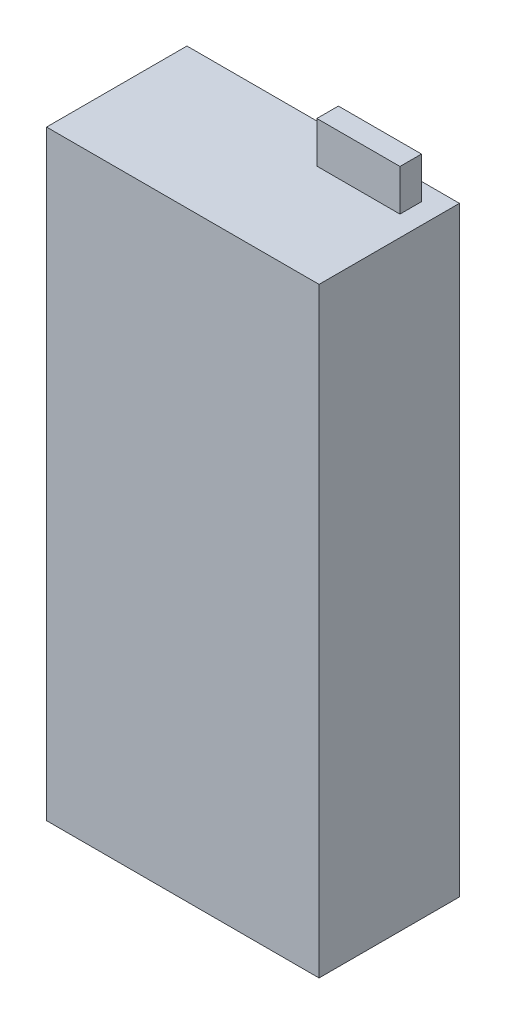
ISO-10303-21;
HEADER;
FILE_DESCRIPTION(('STEP AP214'),'2;1');
FILE_NAME('part.step','',(''),(''),'','','');
FILE_SCHEMA(('AUTOMOTIVE_DESIGN { 1 0 10303 214 1 1 1 1 }'));
ENDSEC;
DATA;
#1=APPLICATION_CONTEXT('core data for automotive mechanical design processes');
#2=APPLICATION_PROTOCOL_DEFINITION('international standard','automotive_design',2000,#1);
#3=PRODUCT_CONTEXT('',#1,'mechanical');
#4=PRODUCT('Part','Part','',(#3));
#5=PRODUCT_RELATED_PRODUCT_CATEGORY('part','',(#4));
#6=PRODUCT_DEFINITION_FORMATION('','',#4);
#7=PRODUCT_DEFINITION_CONTEXT('part definition',#1,'design');
#8=PRODUCT_DEFINITION('design','',#6,#7);
#9=PRODUCT_DEFINITION_SHAPE('','',#8);
#10=(LENGTH_UNIT() NAMED_UNIT(*) SI_UNIT(.MILLI.,.METRE.));
#11=(NAMED_UNIT(*) PLANE_ANGLE_UNIT() SI_UNIT($,.RADIAN.));
#12=(NAMED_UNIT(*) SI_UNIT($,.STERADIAN.) SOLID_ANGLE_UNIT());
#13=UNCERTAINTY_MEASURE_WITH_UNIT(LENGTH_MEASURE(1.E-05),#10,'distance_accuracy_value','');
#14=(GEOMETRIC_REPRESENTATION_CONTEXT(3) GLOBAL_UNCERTAINTY_ASSIGNED_CONTEXT((#13)) GLOBAL_UNIT_ASSIGNED_CONTEXT((#10,
#11,#12)) REPRESENTATION_CONTEXT('',''));
#15=CARTESIAN_POINT('',(0.,0.,0.));
#16=DIRECTION('',(0.,0.,1.));
#17=DIRECTION('',(1.,0.,0.));
#18=AXIS2_PLACEMENT_3D('',#15,#16,#17);
#19=CARTESIAN_POINT('',(-193.074626865671,287.149253731343,68.));
#20=DIRECTION('',(0.,-1.,0.));
#21=DIRECTION('',(0.,0.,-1.));
#22=AXIS2_PLACEMENT_3D('',#19,#20,#21);
#23=PLANE('',#22);
#24=DIRECTION('',(-1.,0.,0.));
#25=VECTOR('',#24,1.);
#26=CARTESIAN_POINT('',(-193.074626865671,287.149253731343,0.));
#27=LINE('',#26,#25);
#28=CARTESIAN_POINT('',(-61.0746268656714,287.149253731343,0.));
#29=VERTEX_POINT('',#28);
#30=CARTESIAN_POINT('',(-193.074626865671,287.149253731343,0.));
#31=VERTEX_POINT('',#30);
#32=EDGE_CURVE('E260',#29,#31,#27,.T.);
#33=ORIENTED_EDGE('',*,*,#32,.T.);
#34=DIRECTION('',(0.,0.,-1.));
#35=VECTOR('',#34,1.);
#36=CARTESIAN_POINT('',(-193.074626865671,287.149253731343,68.));
#37=LINE('',#36,#35);
#38=CARTESIAN_POINT('',(-193.074626865671,287.149253731343,68.));
#39=VERTEX_POINT('',#38);
#40=EDGE_CURVE('E270',#39,#31,#37,.T.);
#41=ORIENTED_EDGE('',*,*,#40,.F.);
#42=DIRECTION('',(-1.,0.,0.));
#43=VECTOR('',#42,1.);
#44=CARTESIAN_POINT('',(-193.074626865671,287.149253731343,68.));
#45=LINE('',#44,#43);
#46=CARTESIAN_POINT('',(-61.0746268656714,287.149253731343,68.));
#47=VERTEX_POINT('',#46);
#48=EDGE_CURVE('E250',#47,#39,#45,.T.);
#49=ORIENTED_EDGE('',*,*,#48,.F.);
#50=DIRECTION('',(0.,0.,-1.));
#51=VECTOR('',#50,1.);
#52=CARTESIAN_POINT('',(-61.0746268656714,287.149253731343,68.));
#53=LINE('',#52,#51);
#54=EDGE_CURVE('E55',#47,#29,#53,.T.);
#55=ORIENTED_EDGE('',*,*,#54,.T.);
#56=EDGE_LOOP('',(#33,#41,#49,#55));
#57=FACE_BOUND('',#56,.T.);
#58=DIRECTION('',(0.,0.,-1.));
#59=VECTOR('',#58,1.);
#60=CARTESIAN_POINT('',(-70.9483850455754,287.149253731343,18.9315760103987));
#61=LINE('',#60,#59);
#62=CARTESIAN_POINT('',(-70.9483850455754,287.149253731343,18.9315760103987));
#63=VERTEX_POINT('',#62);
#64=CARTESIAN_POINT('',(-70.9483850455754,287.149253731343,8.50918604596274));
#65=VERTEX_POINT('',#64);
#66=EDGE_CURVE('E156',#63,#65,#61,.T.);
#67=ORIENTED_EDGE('',*,*,#66,.F.);
#68=DIRECTION('',(1.,0.,0.));
#69=VECTOR('',#68,1.);
#70=CARTESIAN_POINT('',(-70.9483850455754,287.149253731343,18.9315760103987));
#71=LINE('',#70,#69);
#72=CARTESIAN_POINT('',(-111.202194247014,287.149253731343,18.9315760103987));
#73=VERTEX_POINT('',#72);
#74=EDGE_CURVE('E153',#73,#63,#71,.T.);
#75=ORIENTED_EDGE('',*,*,#74,.F.);
#76=DIRECTION('',(0.,0.,1.));
#77=VECTOR('',#76,1.);
#78=CARTESIAN_POINT('',(-111.202194247014,287.149253731343,18.9315760103987));
#79=LINE('',#78,#77);
#80=CARTESIAN_POINT('',(-111.202194247014,287.149253731343,8.50918604596274));
#81=VERTEX_POINT('',#80);
#82=EDGE_CURVE('E67',#81,#73,#79,.T.);
#83=ORIENTED_EDGE('',*,*,#82,.F.);
#84=DIRECTION('',(-1.,0.,0.));
#85=VECTOR('',#84,1.);
#86=CARTESIAN_POINT('',(-70.9483850455754,287.149253731343,8.50918604596274));
#87=LINE('',#86,#85);
#88=EDGE_CURVE('E62',#65,#81,#87,.T.);
#89=ORIENTED_EDGE('',*,*,#88,.F.);
#90=EDGE_LOOP('',(#67,#75,#83,#89));
#91=FACE_BOUND('',#90,.T.);
#92=ADVANCED_FACE('F47',(#57,#91),#23,.F.);
#93=CARTESIAN_POINT('',(-193.074626865671,-3.85074626865733,68.));
#94=DIRECTION('',(0.,1.,0.));
#95=DIRECTION('',(0.,0.,1.));
#96=AXIS2_PLACEMENT_3D('',#93,#94,#95);
#97=PLANE('',#96);
#98=CARTESIAN_POINT('',(-94.2518577073983,-3.85074626865733,37.5871900616787));
#99=DIRECTION('',(0.,1.,0.));
#100=DIRECTION('',(0.,0.,1.));
#101=AXIS2_PLACEMENT_3D('',#98,#99,#100);
#102=CIRCLE('',#101,24.1206050750484);
#103=CARTESIAN_POINT('',(-94.2518577073983,-3.85074626865733,61.707795136727));
#104=VERTEX_POINT('',#103);
#105=EDGE_CURVE('E13',#104,#104,#102,.F.);
#106=ORIENTED_EDGE('',*,*,#105,.F.);
#107=EDGE_LOOP('',(#106));
#108=FACE_BOUND('',#107,.T.);
#109=DIRECTION('',(1.,0.,0.));
#110=VECTOR('',#109,1.);
#111=CARTESIAN_POINT('',(-193.074626865671,-3.85074626865733,0.));
#112=LINE('',#111,#110);
#113=CARTESIAN_POINT('',(-193.074626865671,-3.85074626865733,0.));
#114=VERTEX_POINT('',#113);
#115=CARTESIAN_POINT('',(-61.0746268656714,-3.85074626865733,0.));
#116=VERTEX_POINT('',#115);
#117=EDGE_CURVE('E251',#114,#116,#112,.T.);
#118=ORIENTED_EDGE('',*,*,#117,.T.);
#119=DIRECTION('',(0.,0.,-1.));
#120=VECTOR('',#119,1.);
#121=CARTESIAN_POINT('',(-61.0746268656714,-3.85074626865733,68.));
#122=LINE('',#121,#120);
#123=CARTESIAN_POINT('',(-61.0746268656714,-3.85074626865733,68.));
#124=VERTEX_POINT('',#123);
#125=EDGE_CURVE('E257',#124,#116,#122,.T.);
#126=ORIENTED_EDGE('',*,*,#125,.F.);
#127=DIRECTION('',(1.,0.,0.));
#128=VECTOR('',#127,1.);
#129=CARTESIAN_POINT('',(-193.074626865671,-3.85074626865733,68.));
#130=LINE('',#129,#128);
#131=CARTESIAN_POINT('',(-193.074626865671,-3.85074626865733,68.));
#132=VERTEX_POINT('',#131);
#133=EDGE_CURVE('E255',#132,#124,#130,.T.);
#134=ORIENTED_EDGE('',*,*,#133,.F.);
#135=DIRECTION('',(0.,0.,-1.));
#136=VECTOR('',#135,1.);
#137=CARTESIAN_POINT('',(-193.074626865671,-3.85074626865733,68.));
#138=LINE('',#137,#136);
#139=EDGE_CURVE('E267',#132,#114,#138,.T.);
#140=ORIENTED_EDGE('',*,*,#139,.T.);
#141=EDGE_LOOP('',(#118,#126,#134,#140));
#142=FACE_BOUND('',#141,.T.);
#143=DIRECTION('',(0.,0.,-1.));
#144=VECTOR('',#143,1.);
#145=CARTESIAN_POINT('',(-178.598349927007,-3.85074626865733,24.2213644367162));
#146=LINE('',#145,#144);
#147=CARTESIAN_POINT('',(-178.598349927007,-3.85074626865733,24.2213644367162));
#148=VERTEX_POINT('',#147);
#149=CARTESIAN_POINT('',(-178.598349927007,-3.85074626865733,14.0191888236423));
#150=VERTEX_POINT('',#149);
#151=EDGE_CURVE('E160',#148,#150,#146,.T.);
#152=ORIENTED_EDGE('',*,*,#151,.F.);
#153=DIRECTION('',(-1.,0.,0.));
#154=VECTOR('',#153,1.);
#155=CARTESIAN_POINT('',(-178.598349927007,-3.85074626865733,24.2213644367162));
#156=LINE('',#155,#154);
#157=CARTESIAN_POINT('',(-125.545069393354,-3.85074626865733,24.2213644367162));
#158=VERTEX_POINT('',#157);
#159=EDGE_CURVE('E170',#158,#148,#156,.T.);
#160=ORIENTED_EDGE('',*,*,#159,.F.);
#161=DIRECTION('',(0.,0.,1.));
#162=VECTOR('',#161,1.);
#163=CARTESIAN_POINT('',(-125.545069393354,-3.85074626865733,24.2213644367162));
#164=LINE('',#163,#162);
#165=CARTESIAN_POINT('',(-125.545069393354,-3.85074626865733,14.0191888236423));
#166=VERTEX_POINT('',#165);
#167=EDGE_CURVE('E182',#166,#158,#164,.T.);
#168=ORIENTED_EDGE('',*,*,#167,.F.);
#169=DIRECTION('',(1.,0.,0.));
#170=VECTOR('',#169,1.);
#171=CARTESIAN_POINT('',(-178.598349927007,-3.85074626865733,14.0191888236423));
#172=LINE('',#171,#170);
#173=EDGE_CURVE('E179',#150,#166,#172,.T.);
#174=ORIENTED_EDGE('',*,*,#173,.F.);
#175=EDGE_LOOP('',(#152,#160,#168,#174));
#176=FACE_BOUND('',#175,.T.);
#177=ADVANCED_FACE('F290',(#108,#142,#176),#97,.F.);
#178=CARTESIAN_POINT('',(-61.0746268656714,287.149253731343,68.));
#179=DIRECTION('',(-1.,0.,0.));
#180=DIRECTION('',(0.,-1.,0.));
#181=AXIS2_PLACEMENT_3D('',#178,#179,#180);
#182=PLANE('',#181);
#183=DIRECTION('',(0.,1.,0.));
#184=VECTOR('',#183,1.);
#185=CARTESIAN_POINT('',(-61.0746268656714,287.149253731343,0.));
#186=LINE('',#185,#184);
#187=EDGE_CURVE('E244',#116,#29,#186,.T.);
#188=ORIENTED_EDGE('',*,*,#187,.T.);
#189=ORIENTED_EDGE('',*,*,#54,.F.);
#190=DIRECTION('',(0.,1.,0.));
#191=VECTOR('',#190,1.);
#192=CARTESIAN_POINT('',(-61.0746268656714,287.149253731343,68.));
#193=LINE('',#192,#191);
#194=EDGE_CURVE('E247',#124,#47,#193,.T.);
#195=ORIENTED_EDGE('',*,*,#194,.F.);
#196=ORIENTED_EDGE('',*,*,#125,.T.);
#197=EDGE_LOOP('',(#188,#189,#195,#196));
#198=FACE_BOUND('',#197,.T.);
#199=ADVANCED_FACE('F49',(#198),#182,.F.);
#200=CARTESIAN_POINT('',(-193.074626865671,287.149253731343,68.));
#201=DIRECTION('',(1.,0.,0.));
#202=DIRECTION('',(0.,1.,0.));
#203=AXIS2_PLACEMENT_3D('',#200,#201,#202);
#204=PLANE('',#203);
#205=CARTESIAN_POINT('',(-193.074626865671,23.1492537313427,55.5));
#206=DIRECTION('',(-1.,0.,0.));
#207=DIRECTION('',(0.,-1.,0.));
#208=AXIS2_PLACEMENT_3D('',#205,#206,#207);
#209=CIRCLE('',#208,2.);
#210=CARTESIAN_POINT('',(-193.074626865671,21.1492537313427,55.5));
#211=VERTEX_POINT('',#210);
#212=EDGE_CURVE('E221',#211,#211,#209,.T.);
#213=ORIENTED_EDGE('',*,*,#212,.F.);
#214=EDGE_LOOP('',(#213));
#215=FACE_BOUND('',#214,.T.);
#216=CARTESIAN_POINT('',(-193.074626865671,33.1492537313427,55.5));
#217=DIRECTION('',(-1.,0.,0.));
#218=DIRECTION('',(0.,-1.,0.));
#219=AXIS2_PLACEMENT_3D('',#216,#217,#218);
#220=CIRCLE('',#219,2.);
#221=CARTESIAN_POINT('',(-193.074626865671,31.1492537313427,55.5));
#222=VERTEX_POINT('',#221);
#223=EDGE_CURVE('E227',#222,#222,#220,.T.);
#224=ORIENTED_EDGE('',*,*,#223,.F.);
#225=EDGE_LOOP('',(#224));
#226=FACE_BOUND('',#225,.T.);
#227=CARTESIAN_POINT('',(-193.074626865671,33.1492537313427,17.5));
#228=DIRECTION('',(-1.,0.,0.));
#229=DIRECTION('',(0.,-1.,0.));
#230=AXIS2_PLACEMENT_3D('',#227,#228,#229);
#231=CIRCLE('',#230,2.);
#232=CARTESIAN_POINT('',(-193.074626865671,31.1492537313427,17.5));
#233=VERTEX_POINT('',#232);
#234=EDGE_CURVE('E233',#233,#233,#231,.T.);
#235=ORIENTED_EDGE('',*,*,#234,.F.);
#236=EDGE_LOOP('',(#235));
#237=FACE_BOUND('',#236,.T.);
#238=CARTESIAN_POINT('',(-193.074626865671,269.449253731343,17.5));
#239=DIRECTION('',(-1.,0.,0.));
#240=DIRECTION('',(0.,1.,0.));
#241=AXIS2_PLACEMENT_3D('',#238,#239,#240);
#242=CIRCLE('',#241,2.00000000000001);
#243=CARTESIAN_POINT('',(-193.074626865671,271.449253731343,17.5));
#244=VERTEX_POINT('',#243);
#245=EDGE_CURVE('E202',#244,#244,#242,.T.);
#246=ORIENTED_EDGE('',*,*,#245,.F.);
#247=EDGE_LOOP('',(#246));
#248=FACE_BOUND('',#247,.T.);
#249=CARTESIAN_POINT('',(-193.074626865671,259.449253731343,17.5));
#250=DIRECTION('',(-1.,0.,0.));
#251=DIRECTION('',(0.,1.,0.));
#252=AXIS2_PLACEMENT_3D('',#249,#250,#251);
#253=CIRCLE('',#252,2.);
#254=CARTESIAN_POINT('',(-193.074626865671,261.449253731343,17.5));
#255=VERTEX_POINT('',#254);
#256=EDGE_CURVE('E203',#255,#255,#253,.T.);
#257=ORIENTED_EDGE('',*,*,#256,.F.);
#258=EDGE_LOOP('',(#257));
#259=FACE_BOUND('',#258,.T.);
#260=CARTESIAN_POINT('',(-193.074626865671,259.449253731343,55.5));
#261=DIRECTION('',(-1.,0.,0.));
#262=DIRECTION('',(0.,1.,0.));
#263=AXIS2_PLACEMENT_3D('',#260,#261,#262);
#264=CIRCLE('',#263,2.);
#265=CARTESIAN_POINT('',(-193.074626865671,261.449253731343,55.5));
#266=VERTEX_POINT('',#265);
#267=EDGE_CURVE('E209',#266,#266,#264,.T.);
#268=ORIENTED_EDGE('',*,*,#267,.F.);
#269=EDGE_LOOP('',(#268));
#270=FACE_BOUND('',#269,.T.);
#271=CARTESIAN_POINT('',(-193.074626865671,269.449253731343,55.5));
#272=DIRECTION('',(-1.,0.,0.));
#273=DIRECTION('',(0.,1.,0.));
#274=AXIS2_PLACEMENT_3D('',#271,#272,#273);
#275=CIRCLE('',#274,2.);
#276=CARTESIAN_POINT('',(-193.074626865671,271.449253731343,55.5));
#277=VERTEX_POINT('',#276);
#278=EDGE_CURVE('E198',#277,#277,#275,.T.);
#279=ORIENTED_EDGE('',*,*,#278,.F.);
#280=EDGE_LOOP('',(#279));
#281=FACE_BOUND('',#280,.T.);
#282=CARTESIAN_POINT('',(-193.074626865671,23.1492537313427,17.5));
#283=DIRECTION('',(-1.,0.,0.));
#284=DIRECTION('',(0.,-1.,0.));
#285=AXIS2_PLACEMENT_3D('',#282,#283,#284);
#286=CIRCLE('',#285,2.);
#287=CARTESIAN_POINT('',(-193.074626865671,21.1492537313427,17.5));
#288=VERTEX_POINT('',#287);
#289=EDGE_CURVE('E220',#288,#288,#286,.T.);
#290=ORIENTED_EDGE('',*,*,#289,.F.);
#291=EDGE_LOOP('',(#290));
#292=FACE_BOUND('',#291,.T.);
#293=DIRECTION('',(0.,-1.,0.));
#294=VECTOR('',#293,1.);
#295=CARTESIAN_POINT('',(-193.074626865671,287.149253731343,0.));
#296=LINE('',#295,#294);
#297=EDGE_CURVE('E262',#31,#114,#296,.T.);
#298=ORIENTED_EDGE('',*,*,#297,.T.);
#299=ORIENTED_EDGE('',*,*,#139,.F.);
#300=DIRECTION('',(0.,-1.,0.));
#301=VECTOR('',#300,1.);
#302=CARTESIAN_POINT('',(-193.074626865671,287.149253731343,68.));
#303=LINE('',#302,#301);
#304=EDGE_CURVE('E253',#39,#132,#303,.T.);
#305=ORIENTED_EDGE('',*,*,#304,.F.);
#306=ORIENTED_EDGE('',*,*,#40,.T.);
#307=EDGE_LOOP('',(#298,#299,#305,#306));
#308=FACE_BOUND('',#307,.T.);
#309=ADVANCED_FACE('F286',(#215,#226,#237,#248,#259,#270,#281,#292,#308),#204,.F.);
#310=CARTESIAN_POINT('',(0.,0.,68.));
#311=DIRECTION('',(0.,0.,1.));
#312=DIRECTION('',(1.,0.,0.));
#313=AXIS2_PLACEMENT_3D('',#310,#311,#312);
#314=PLANE('',#313);
#315=ORIENTED_EDGE('',*,*,#194,.T.);
#316=ORIENTED_EDGE('',*,*,#48,.T.);
#317=ORIENTED_EDGE('',*,*,#304,.T.);
#318=ORIENTED_EDGE('',*,*,#133,.T.);
#319=EDGE_LOOP('',(#315,#316,#317,#318));
#320=FACE_BOUND('',#319,.T.);
#321=ADVANCED_FACE('F293',(#320),#314,.T.);
#322=CARTESIAN_POINT('',(0.,0.,0.));
#323=DIRECTION('',(0.,0.,1.));
#324=DIRECTION('',(1.,0.,0.));
#325=AXIS2_PLACEMENT_3D('',#322,#323,#324);
#326=PLANE('',#325);
#327=ORIENTED_EDGE('',*,*,#187,.F.);
#328=ORIENTED_EDGE('',*,*,#117,.F.);
#329=ORIENTED_EDGE('',*,*,#297,.F.);
#330=ORIENTED_EDGE('',*,*,#32,.F.);
#331=EDGE_LOOP('',(#327,#328,#329,#330));
#332=FACE_BOUND('',#331,.T.);
#333=ADVANCED_FACE('F282',(#332),#326,.F.);
#334=CARTESIAN_POINT('',(-189.074626865671,23.1492537313427,17.5));
#335=DIRECTION('',(-1.,0.,0.));
#336=DIRECTION('',(0.,-1.,0.));
#337=AXIS2_PLACEMENT_3D('',#334,#335,#336);
#338=CYLINDRICAL_SURFACE('',#337,2.);
#339=CARTESIAN_POINT('',(-189.074626865671,23.1492537313427,17.5));
#340=DIRECTION('',(-1.,0.,0.));
#341=DIRECTION('',(0.,-1.,0.));
#342=AXIS2_PLACEMENT_3D('',#339,#340,#341);
#343=CIRCLE('',#342,2.);
#344=CARTESIAN_POINT('',(-189.074626865671,21.1492537313427,17.5));
#345=VERTEX_POINT('',#344);
#346=EDGE_CURVE('E241',#345,#345,#343,.T.);
#347=ORIENTED_EDGE('',*,*,#346,.F.);
#348=EDGE_LOOP('',(#347));
#349=FACE_BOUND('',#348,.T.);
#350=ORIENTED_EDGE('',*,*,#289,.T.);
#351=EDGE_LOOP('',(#350));
#352=FACE_BOUND('',#351,.T.);
#353=ADVANCED_FACE('F300',(#349,#352),#338,.F.);
#354=CARTESIAN_POINT('',(-189.074626865671,23.1492537313427,17.5));
#355=DIRECTION('',(-1.,0.,0.));
#356=DIRECTION('',(0.,-1.,0.));
#357=AXIS2_PLACEMENT_3D('',#354,#355,#356);
#358=PLANE('',#357);
#359=ORIENTED_EDGE('',*,*,#346,.T.);
#360=EDGE_LOOP('',(#359));
#361=FACE_BOUND('',#360,.T.);
#362=ADVANCED_FACE('F374',(#361),#358,.T.);
#363=CARTESIAN_POINT('',(-189.074626865671,269.449253731343,55.5));
#364=DIRECTION('',(-1.,0.,0.));
#365=DIRECTION('',(0.,-1.,0.));
#366=AXIS2_PLACEMENT_3D('',#363,#364,#365);
#367=CYLINDRICAL_SURFACE('',#366,2.);
#368=CARTESIAN_POINT('',(-189.074626865671,269.449253731343,55.5));
#369=DIRECTION('',(-1.,0.,0.));
#370=DIRECTION('',(0.,1.,0.));
#371=AXIS2_PLACEMENT_3D('',#368,#369,#370);
#372=CIRCLE('',#371,2.);
#373=CARTESIAN_POINT('',(-189.074626865671,271.449253731343,55.5));
#374=VERTEX_POINT('',#373);
#375=EDGE_CURVE('E212',#374,#374,#372,.T.);
#376=ORIENTED_EDGE('',*,*,#375,.F.);
#377=EDGE_LOOP('',(#376));
#378=FACE_BOUND('',#377,.T.);
#379=ORIENTED_EDGE('',*,*,#278,.T.);
#380=EDGE_LOOP('',(#379));
#381=FACE_BOUND('',#380,.T.);
#382=ADVANCED_FACE('F370',(#378,#381),#367,.F.);
#383=CARTESIAN_POINT('',(-189.074626865671,269.449253731343,55.5));
#384=DIRECTION('',(1.,0.,0.));
#385=DIRECTION('',(0.,1.,0.));
#386=AXIS2_PLACEMENT_3D('',#383,#384,#385);
#387=PLANE('',#386);
#388=ORIENTED_EDGE('',*,*,#375,.T.);
#389=EDGE_LOOP('',(#388));
#390=FACE_BOUND('',#389,.T.);
#391=ADVANCED_FACE('F366',(#390),#387,.F.);
#392=CARTESIAN_POINT('',(-189.074626865671,259.449253731343,55.5));
#393=DIRECTION('',(-1.,0.,0.));
#394=DIRECTION('',(0.,-1.,0.));
#395=AXIS2_PLACEMENT_3D('',#392,#393,#394);
#396=CYLINDRICAL_SURFACE('',#395,2.);
#397=CARTESIAN_POINT('',(-189.074626865671,259.449253731343,55.5));
#398=DIRECTION('',(-1.,0.,0.));
#399=DIRECTION('',(0.,1.,0.));
#400=AXIS2_PLACEMENT_3D('',#397,#398,#399);
#401=CIRCLE('',#400,2.);
#402=CARTESIAN_POINT('',(-189.074626865671,261.449253731343,55.5));
#403=VERTEX_POINT('',#402);
#404=EDGE_CURVE('E206',#403,#403,#401,.T.);
#405=ORIENTED_EDGE('',*,*,#404,.F.);
#406=EDGE_LOOP('',(#405));
#407=FACE_BOUND('',#406,.T.);
#408=ORIENTED_EDGE('',*,*,#267,.T.);
#409=EDGE_LOOP('',(#408));
#410=FACE_BOUND('',#409,.T.);
#411=ADVANCED_FACE('F362',(#407,#410),#396,.F.);
#412=CARTESIAN_POINT('',(-189.074626865671,259.449253731343,55.5));
#413=DIRECTION('',(1.,0.,0.));
#414=DIRECTION('',(0.,1.,0.));
#415=AXIS2_PLACEMENT_3D('',#412,#413,#414);
#416=PLANE('',#415);
#417=ORIENTED_EDGE('',*,*,#404,.T.);
#418=EDGE_LOOP('',(#417));
#419=FACE_BOUND('',#418,.T.);
#420=ADVANCED_FACE('F358',(#419),#416,.F.);
#421=CARTESIAN_POINT('',(-189.074626865671,259.449253731343,17.5));
#422=DIRECTION('',(-1.,0.,0.));
#423=DIRECTION('',(0.,-1.,0.));
#424=AXIS2_PLACEMENT_3D('',#421,#422,#423);
#425=CYLINDRICAL_SURFACE('',#424,2.);
#426=CARTESIAN_POINT('',(-189.074626865671,259.449253731343,17.5));
#427=DIRECTION('',(-1.,0.,0.));
#428=DIRECTION('',(0.,1.,0.));
#429=AXIS2_PLACEMENT_3D('',#426,#427,#428);
#430=CIRCLE('',#429,2.);
#431=CARTESIAN_POINT('',(-189.074626865671,261.449253731343,17.5));
#432=VERTEX_POINT('',#431);
#433=EDGE_CURVE('E199',#432,#432,#430,.T.);
#434=ORIENTED_EDGE('',*,*,#433,.F.);
#435=EDGE_LOOP('',(#434));
#436=FACE_BOUND('',#435,.T.);
#437=ORIENTED_EDGE('',*,*,#256,.T.);
#438=EDGE_LOOP('',(#437));
#439=FACE_BOUND('',#438,.T.);
#440=ADVANCED_FACE('F354',(#436,#439),#425,.F.);
#441=CARTESIAN_POINT('',(-189.074626865671,259.449253731343,17.5));
#442=DIRECTION('',(1.,0.,0.));
#443=DIRECTION('',(0.,1.,0.));
#444=AXIS2_PLACEMENT_3D('',#441,#442,#443);
#445=PLANE('',#444);
#446=ORIENTED_EDGE('',*,*,#433,.T.);
#447=EDGE_LOOP('',(#446));
#448=FACE_BOUND('',#447,.T.);
#449=ADVANCED_FACE('F350',(#448),#445,.F.);
#450=CARTESIAN_POINT('',(-189.074626865671,269.449253731343,17.5));
#451=DIRECTION('',(-1.,0.,0.));
#452=DIRECTION('',(0.,-1.,0.));
#453=AXIS2_PLACEMENT_3D('',#450,#451,#452);
#454=CYLINDRICAL_SURFACE('',#453,2.00000000000001);
#455=CARTESIAN_POINT('',(-189.074626865671,269.449253731343,17.5));
#456=DIRECTION('',(-1.,0.,0.));
#457=DIRECTION('',(0.,1.,0.));
#458=AXIS2_PLACEMENT_3D('',#455,#456,#457);
#459=CIRCLE('',#458,2.00000000000001);
#460=CARTESIAN_POINT('',(-189.074626865671,271.449253731343,17.5));
#461=VERTEX_POINT('',#460);
#462=EDGE_CURVE('E236',#461,#461,#459,.T.);
#463=ORIENTED_EDGE('',*,*,#462,.F.);
#464=EDGE_LOOP('',(#463));
#465=FACE_BOUND('',#464,.T.);
#466=ORIENTED_EDGE('',*,*,#245,.T.);
#467=EDGE_LOOP('',(#466));
#468=FACE_BOUND('',#467,.T.);
#469=ADVANCED_FACE('F353',(#465,#468),#454,.F.);
#470=CARTESIAN_POINT('',(-189.074626865671,269.449253731343,17.5));
#471=DIRECTION('',(1.,0.,0.));
#472=DIRECTION('',(0.,1.,0.));
#473=AXIS2_PLACEMENT_3D('',#470,#471,#472);
#474=PLANE('',#473);
#475=ORIENTED_EDGE('',*,*,#462,.T.);
#476=EDGE_LOOP('',(#475));
#477=FACE_BOUND('',#476,.T.);
#478=ADVANCED_FACE('F398',(#477),#474,.F.);
#479=CARTESIAN_POINT('',(-189.074626865671,33.1492537313427,17.5));
#480=DIRECTION('',(-1.,0.,0.));
#481=DIRECTION('',(0.,-1.,0.));
#482=AXIS2_PLACEMENT_3D('',#479,#480,#481);
#483=CYLINDRICAL_SURFACE('',#482,2.);
#484=CARTESIAN_POINT('',(-189.074626865671,33.1492537313427,17.5));
#485=DIRECTION('',(-1.,0.,0.));
#486=DIRECTION('',(0.,-1.,0.));
#487=AXIS2_PLACEMENT_3D('',#484,#485,#486);
#488=CIRCLE('',#487,2.);
#489=CARTESIAN_POINT('',(-189.074626865671,31.1492537313427,17.5));
#490=VERTEX_POINT('',#489);
#491=EDGE_CURVE('E230',#490,#490,#488,.T.);
#492=ORIENTED_EDGE('',*,*,#491,.F.);
#493=EDGE_LOOP('',(#492));
#494=FACE_BOUND('',#493,.T.);
#495=ORIENTED_EDGE('',*,*,#234,.T.);
#496=EDGE_LOOP('',(#495));
#497=FACE_BOUND('',#496,.T.);
#498=ADVANCED_FACE('F394',(#494,#497),#483,.F.);
#499=CARTESIAN_POINT('',(-189.074626865671,33.1492537313427,17.5));
#500=DIRECTION('',(-1.,0.,0.));
#501=DIRECTION('',(0.,-1.,0.));
#502=AXIS2_PLACEMENT_3D('',#499,#500,#501);
#503=PLANE('',#502);
#504=ORIENTED_EDGE('',*,*,#491,.T.);
#505=EDGE_LOOP('',(#504));
#506=FACE_BOUND('',#505,.T.);
#507=ADVANCED_FACE('F390',(#506),#503,.T.);
#508=CARTESIAN_POINT('',(-189.074626865671,33.1492537313427,55.5));
#509=DIRECTION('',(-1.,0.,0.));
#510=DIRECTION('',(0.,-1.,0.));
#511=AXIS2_PLACEMENT_3D('',#508,#509,#510);
#512=CYLINDRICAL_SURFACE('',#511,2.);
#513=CARTESIAN_POINT('',(-189.074626865671,33.1492537313427,55.5));
#514=DIRECTION('',(-1.,0.,0.));
#515=DIRECTION('',(0.,-1.,0.));
#516=AXIS2_PLACEMENT_3D('',#513,#514,#515);
#517=CIRCLE('',#516,2.);
#518=CARTESIAN_POINT('',(-189.074626865671,31.1492537313427,55.5));
#519=VERTEX_POINT('',#518);
#520=EDGE_CURVE('E224',#519,#519,#517,.T.);
#521=ORIENTED_EDGE('',*,*,#520,.F.);
#522=EDGE_LOOP('',(#521));
#523=FACE_BOUND('',#522,.T.);
#524=ORIENTED_EDGE('',*,*,#223,.T.);
#525=EDGE_LOOP('',(#524));
#526=FACE_BOUND('',#525,.T.);
#527=ADVANCED_FACE('F386',(#523,#526),#512,.F.);
#528=CARTESIAN_POINT('',(-189.074626865671,33.1492537313427,55.5));
#529=DIRECTION('',(-1.,0.,0.));
#530=DIRECTION('',(0.,-1.,0.));
#531=AXIS2_PLACEMENT_3D('',#528,#529,#530);
#532=PLANE('',#531);
#533=ORIENTED_EDGE('',*,*,#520,.T.);
#534=EDGE_LOOP('',(#533));
#535=FACE_BOUND('',#534,.T.);
#536=ADVANCED_FACE('F382',(#535),#532,.T.);
#537=CARTESIAN_POINT('',(-189.074626865671,23.1492537313427,55.5));
#538=DIRECTION('',(-1.,0.,0.));
#539=DIRECTION('',(0.,-1.,0.));
#540=AXIS2_PLACEMENT_3D('',#537,#538,#539);
#541=CYLINDRICAL_SURFACE('',#540,2.);
#542=CARTESIAN_POINT('',(-189.074626865671,23.1492537313427,55.5));
#543=DIRECTION('',(-1.,0.,0.));
#544=DIRECTION('',(0.,-1.,0.));
#545=AXIS2_PLACEMENT_3D('',#542,#543,#544);
#546=CIRCLE('',#545,2.);
#547=CARTESIAN_POINT('',(-189.074626865671,21.1492537313427,55.5));
#548=VERTEX_POINT('',#547);
#549=EDGE_CURVE('E217',#548,#548,#546,.T.);
#550=ORIENTED_EDGE('',*,*,#549,.F.);
#551=EDGE_LOOP('',(#550));
#552=FACE_BOUND('',#551,.T.);
#553=ORIENTED_EDGE('',*,*,#212,.T.);
#554=EDGE_LOOP('',(#553));
#555=FACE_BOUND('',#554,.T.);
#556=ADVANCED_FACE('F378',(#552,#555),#541,.F.);
#557=CARTESIAN_POINT('',(-189.074626865671,23.1492537313427,55.5));
#558=DIRECTION('',(-1.,0.,0.));
#559=DIRECTION('',(0.,-1.,0.));
#560=AXIS2_PLACEMENT_3D('',#557,#558,#559);
#561=PLANE('',#560);
#562=ORIENTED_EDGE('',*,*,#549,.T.);
#563=EDGE_LOOP('',(#562));
#564=FACE_BOUND('',#563,.T.);
#565=ADVANCED_FACE('F348',(#564),#561,.T.);
#566=CARTESIAN_POINT('',(-178.598349927007,-23.8507462686573,24.2213644367162));
#567=DIRECTION('',(1.,0.,0.));
#568=DIRECTION('',(0.,0.,-1.));
#569=AXIS2_PLACEMENT_3D('',#566,#567,#568);
#570=PLANE('',#569);
#571=ORIENTED_EDGE('',*,*,#151,.T.);
#572=DIRECTION('',(0.,1.,0.));
#573=VECTOR('',#572,1.);
#574=CARTESIAN_POINT('',(-178.598349927007,-23.8507462686573,14.0191888236423));
#575=LINE('',#574,#573);
#576=CARTESIAN_POINT('',(-178.598349927007,-23.8507462686573,14.0191888236423));
#577=VERTEX_POINT('',#576);
#578=EDGE_CURVE('E195',#577,#150,#575,.T.);
#579=ORIENTED_EDGE('',*,*,#578,.F.);
#580=DIRECTION('',(0.,0.,-1.));
#581=VECTOR('',#580,1.);
#582=CARTESIAN_POINT('',(-178.598349927007,-23.8507462686573,24.2213644367162));
#583=LINE('',#582,#581);
#584=CARTESIAN_POINT('',(-178.598349927007,-23.8507462686573,24.2213644367162));
#585=VERTEX_POINT('',#584);
#586=EDGE_CURVE('E166',#585,#577,#583,.T.);
#587=ORIENTED_EDGE('',*,*,#586,.F.);
#588=DIRECTION('',(0.,1.,0.));
#589=VECTOR('',#588,1.);
#590=CARTESIAN_POINT('',(-178.598349927007,-23.8507462686573,24.2213644367162));
#591=LINE('',#590,#589);
#592=EDGE_CURVE('E176',#585,#148,#591,.T.);
#593=ORIENTED_EDGE('',*,*,#592,.T.);
#594=EDGE_LOOP('',(#571,#579,#587,#593));
#595=FACE_BOUND('',#594,.T.);
#596=ADVANCED_FACE('F344',(#595),#570,.F.);
#597=CARTESIAN_POINT('',(-178.598349927007,-23.8507462686573,14.0191888236423));
#598=DIRECTION('',(0.,0.,1.));
#599=DIRECTION('',(1.,0.,0.));
#600=AXIS2_PLACEMENT_3D('',#597,#598,#599);
#601=PLANE('',#600);
#602=ORIENTED_EDGE('',*,*,#173,.T.);
#603=DIRECTION('',(0.,1.,0.));
#604=VECTOR('',#603,1.);
#605=CARTESIAN_POINT('',(-125.545069393354,-23.8507462686573,14.0191888236423));
#606=LINE('',#605,#604);
#607=CARTESIAN_POINT('',(-125.545069393354,-23.8507462686573,14.0191888236423));
#608=VERTEX_POINT('',#607);
#609=EDGE_CURVE('E192',#608,#166,#606,.T.);
#610=ORIENTED_EDGE('',*,*,#609,.F.);
#611=DIRECTION('',(1.,0.,0.));
#612=VECTOR('',#611,1.);
#613=CARTESIAN_POINT('',(-178.598349927007,-23.8507462686573,14.0191888236423));
#614=LINE('',#613,#612);
#615=EDGE_CURVE('E169',#577,#608,#614,.T.);
#616=ORIENTED_EDGE('',*,*,#615,.F.);
#617=ORIENTED_EDGE('',*,*,#578,.T.);
#618=EDGE_LOOP('',(#602,#610,#616,#617));
#619=FACE_BOUND('',#618,.T.);
#620=ADVANCED_FACE('F340',(#619),#601,.F.);
#621=CARTESIAN_POINT('',(-125.545069393354,-23.8507462686573,24.2213644367162));
#622=DIRECTION('',(-1.,0.,0.));
#623=DIRECTION('',(0.,0.,1.));
#624=AXIS2_PLACEMENT_3D('',#621,#622,#623);
#625=PLANE('',#624);
#626=ORIENTED_EDGE('',*,*,#167,.T.);
#627=DIRECTION('',(0.,1.,0.));
#628=VECTOR('',#627,1.);
#629=CARTESIAN_POINT('',(-125.545069393354,-23.8507462686573,24.2213644367162));
#630=LINE('',#629,#628);
#631=CARTESIAN_POINT('',(-125.545069393354,-23.8507462686573,24.2213644367162));
#632=VERTEX_POINT('',#631);
#633=EDGE_CURVE('E189',#632,#158,#630,.T.);
#634=ORIENTED_EDGE('',*,*,#633,.F.);
#635=DIRECTION('',(0.,0.,1.));
#636=VECTOR('',#635,1.);
#637=CARTESIAN_POINT('',(-125.545069393354,-23.8507462686573,24.2213644367162));
#638=LINE('',#637,#636);
#639=EDGE_CURVE('E172',#608,#632,#638,.T.);
#640=ORIENTED_EDGE('',*,*,#639,.F.);
#641=ORIENTED_EDGE('',*,*,#609,.T.);
#642=EDGE_LOOP('',(#626,#634,#640,#641));
#643=FACE_BOUND('',#642,.T.);
#644=ADVANCED_FACE('F336',(#643),#625,.F.);
#645=CARTESIAN_POINT('',(-178.598349927007,-23.8507462686573,24.2213644367162));
#646=DIRECTION('',(0.,0.,-1.));
#647=DIRECTION('',(-1.,0.,0.));
#648=AXIS2_PLACEMENT_3D('',#645,#646,#647);
#649=PLANE('',#648);
#650=ORIENTED_EDGE('',*,*,#159,.T.);
#651=ORIENTED_EDGE('',*,*,#592,.F.);
#652=DIRECTION('',(-1.,0.,0.));
#653=VECTOR('',#652,1.);
#654=CARTESIAN_POINT('',(-178.598349927007,-23.8507462686573,24.2213644367162));
#655=LINE('',#654,#653);
#656=EDGE_CURVE('E174',#632,#585,#655,.T.);
#657=ORIENTED_EDGE('',*,*,#656,.F.);
#658=ORIENTED_EDGE('',*,*,#633,.T.);
#659=EDGE_LOOP('',(#650,#651,#657,#658));
#660=FACE_BOUND('',#659,.T.);
#661=ADVANCED_FACE('F328',(#660),#649,.F.);
#662=CARTESIAN_POINT('',(0.,-23.8507462686573,0.));
#663=DIRECTION('',(0.,-1.,0.));
#664=DIRECTION('',(0.,0.,-1.));
#665=AXIS2_PLACEMENT_3D('',#662,#663,#664);
#666=PLANE('',#665);
#667=ORIENTED_EDGE('',*,*,#586,.T.);
#668=ORIENTED_EDGE('',*,*,#615,.T.);
#669=ORIENTED_EDGE('',*,*,#639,.T.);
#670=ORIENTED_EDGE('',*,*,#656,.T.);
#671=EDGE_LOOP('',(#667,#668,#669,#670));
#672=FACE_BOUND('',#671,.T.);
#673=ADVANCED_FACE('F319',(#672),#666,.T.);
#674=CARTESIAN_POINT('',(-94.2518577073983,-8.85074626865734,37.5871900616787));
#675=DIRECTION('',(0.,1.,0.));
#676=DIRECTION('',(0.,0.,1.));
#677=AXIS2_PLACEMENT_3D('',#674,#675,#676);
#678=CYLINDRICAL_SURFACE('',#677,24.1206050750484);
#679=CARTESIAN_POINT('',(-94.2518577073983,-8.85074626865734,37.5871900616787));
#680=DIRECTION('',(0.,-1.,0.));
#681=DIRECTION('',(0.,0.,-1.));
#682=AXIS2_PLACEMENT_3D('',#679,#680,#681);
#683=CIRCLE('',#682,24.1206050750484);
#684=CARTESIAN_POINT('',(-94.2518577073983,-8.85074626865734,13.4665849866303));
#685=VERTEX_POINT('',#684);
#686=EDGE_CURVE('E157',#685,#685,#683,.T.);
#687=ORIENTED_EDGE('',*,*,#686,.F.);
#688=EDGE_LOOP('',(#687));
#689=FACE_BOUND('',#688,.T.);
#690=ORIENTED_EDGE('',*,*,#105,.T.);
#691=EDGE_LOOP('',(#690));
#692=FACE_BOUND('',#691,.T.);
#693=ADVANCED_FACE('F316',(#689,#692),#678,.T.);
#694=CARTESIAN_POINT('',(-94.2518577073983,-8.85074626865734,37.5871900616787));
#695=DIRECTION('',(0.,-1.,0.));
#696=DIRECTION('',(0.,0.,-1.));
#697=AXIS2_PLACEMENT_3D('',#694,#695,#696);
#698=PLANE('',#697);
#699=ORIENTED_EDGE('',*,*,#686,.T.);
#700=EDGE_LOOP('',(#699));
#701=FACE_BOUND('',#700,.T.);
#702=ADVANCED_FACE('F318',(#701),#698,.T.);
#703=CARTESIAN_POINT('',(-70.9483850455754,307.149253731343,18.9315760103987));
#704=DIRECTION('',(-1.,0.,0.));
#705=DIRECTION('',(0.,0.,1.));
#706=AXIS2_PLACEMENT_3D('',#703,#704,#705);
#707=PLANE('',#706);
#708=ORIENTED_EDGE('',*,*,#66,.T.);
#709=DIRECTION('',(0.,-1.,0.));
#710=VECTOR('',#709,1.);
#711=CARTESIAN_POINT('',(-70.9483850455754,307.149253731343,8.50918604596274));
#712=LINE('',#711,#710);
#713=CARTESIAN_POINT('',(-70.9483850455754,307.149253731343,8.50918604596274));
#714=VERTEX_POINT('',#713);
#715=EDGE_CURVE('E137',#714,#65,#712,.T.);
#716=ORIENTED_EDGE('',*,*,#715,.F.);
#717=DIRECTION('',(0.,0.,-1.));
#718=VECTOR('',#717,1.);
#719=CARTESIAN_POINT('',(-70.9483850455754,307.149253731343,18.9315760103987));
#720=LINE('',#719,#718);
#721=CARTESIAN_POINT('',(-70.9483850455754,307.149253731343,18.9315760103987));
#722=VERTEX_POINT('',#721);
#723=EDGE_CURVE('E144',#722,#714,#720,.T.);
#724=ORIENTED_EDGE('',*,*,#723,.F.);
#725=DIRECTION('',(0.,-1.,0.));
#726=VECTOR('',#725,1.);
#727=CARTESIAN_POINT('',(-70.9483850455754,307.149253731343,18.9315760103987));
#728=LINE('',#727,#726);
#729=EDGE_CURVE('E566',#722,#63,#728,.T.);
#730=ORIENTED_EDGE('',*,*,#729,.T.);
#731=EDGE_LOOP('',(#708,#716,#724,#730));
#732=FACE_BOUND('',#731,.T.);
#733=ADVANCED_FACE('F155',(#732),#707,.F.);
#734=CARTESIAN_POINT('',(-70.9483850455754,307.149253731343,8.50918604596274));
#735=DIRECTION('',(0.,0.,1.));
#736=DIRECTION('',(1.,0.,0.));
#737=AXIS2_PLACEMENT_3D('',#734,#735,#736);
#738=PLANE('',#737);
#739=ORIENTED_EDGE('',*,*,#88,.T.);
#740=DIRECTION('',(0.,-1.,0.));
#741=VECTOR('',#740,1.);
#742=CARTESIAN_POINT('',(-111.202194247014,307.149253731343,8.50918604596274));
#743=LINE('',#742,#741);
#744=CARTESIAN_POINT('',(-111.202194247014,307.149253731343,8.50918604596274));
#745=VERTEX_POINT('',#744);
#746=EDGE_CURVE('E140',#745,#81,#743,.T.);
#747=ORIENTED_EDGE('',*,*,#746,.F.);
#748=DIRECTION('',(-1.,0.,0.));
#749=VECTOR('',#748,1.);
#750=CARTESIAN_POINT('',(-70.9483850455754,307.149253731343,8.50918604596274));
#751=LINE('',#750,#749);
#752=EDGE_CURVE('E133',#714,#745,#751,.T.);
#753=ORIENTED_EDGE('',*,*,#752,.F.);
#754=ORIENTED_EDGE('',*,*,#715,.T.);
#755=EDGE_LOOP('',(#739,#747,#753,#754));
#756=FACE_BOUND('',#755,.T.);
#757=ADVANCED_FACE('F135',(#756),#738,.F.);
#758=CARTESIAN_POINT('',(-111.202194247014,307.149253731343,18.9315760103987));
#759=DIRECTION('',(1.,0.,0.));
#760=DIRECTION('',(0.,0.,-1.));
#761=AXIS2_PLACEMENT_3D('',#758,#759,#760);
#762=PLANE('',#761);
#763=ORIENTED_EDGE('',*,*,#82,.T.);
#764=DIRECTION('',(0.,-1.,0.));
#765=VECTOR('',#764,1.);
#766=CARTESIAN_POINT('',(-111.202194247014,307.149253731343,18.9315760103987));
#767=LINE('',#766,#765);
#768=CARTESIAN_POINT('',(-111.202194247014,307.149253731343,18.9315760103987));
#769=VERTEX_POINT('',#768);
#770=EDGE_CURVE('E162',#769,#73,#767,.T.);
#771=ORIENTED_EDGE('',*,*,#770,.F.);
#772=DIRECTION('',(0.,0.,1.));
#773=VECTOR('',#772,1.);
#774=CARTESIAN_POINT('',(-111.202194247014,307.149253731343,18.9315760103987));
#775=LINE('',#774,#773);
#776=EDGE_CURVE('E143',#745,#769,#775,.T.);
#777=ORIENTED_EDGE('',*,*,#776,.F.);
#778=ORIENTED_EDGE('',*,*,#746,.T.);
#779=EDGE_LOOP('',(#763,#771,#777,#778));
#780=FACE_BOUND('',#779,.T.);
#781=ADVANCED_FACE('F533',(#780),#762,.F.);
#782=CARTESIAN_POINT('',(-70.9483850455754,307.149253731343,18.9315760103987));
#783=DIRECTION('',(0.,0.,-1.));
#784=DIRECTION('',(-1.,0.,0.));
#785=AXIS2_PLACEMENT_3D('',#782,#783,#784);
#786=PLANE('',#785);
#787=ORIENTED_EDGE('',*,*,#74,.T.);
#788=ORIENTED_EDGE('',*,*,#729,.F.);
#789=DIRECTION('',(1.,0.,0.));
#790=VECTOR('',#789,1.);
#791=CARTESIAN_POINT('',(-70.9483850455754,307.149253731343,18.9315760103987));
#792=LINE('',#791,#790);
#793=EDGE_CURVE('E149',#769,#722,#792,.T.);
#794=ORIENTED_EDGE('',*,*,#793,.F.);
#795=ORIENTED_EDGE('',*,*,#770,.T.);
#796=EDGE_LOOP('',(#787,#788,#794,#795));
#797=FACE_BOUND('',#796,.T.);
#798=ADVANCED_FACE('F542',(#797),#786,.F.);
#799=CARTESIAN_POINT('',(0.,307.149253731343,0.));
#800=DIRECTION('',(0.,1.,0.));
#801=DIRECTION('',(0.,0.,1.));
#802=AXIS2_PLACEMENT_3D('',#799,#800,#801);
#803=PLANE('',#802);
#804=ORIENTED_EDGE('',*,*,#723,.T.);
#805=ORIENTED_EDGE('',*,*,#752,.T.);
#806=ORIENTED_EDGE('',*,*,#776,.T.);
#807=ORIENTED_EDGE('',*,*,#793,.T.);
#808=EDGE_LOOP('',(#804,#805,#806,#807));
#809=FACE_BOUND('',#808,.T.);
#810=ADVANCED_FACE('F147',(#809),#803,.T.);
#811=CLOSED_SHELL('',(#92,#177,#199,#309,#321,#333,#353,#362,#382,#391,#411,#420,#440,#449,#469,
#478,#498,#507,#527,#536,#556,#565,#596,#620,#644,#661,#673,#693,#702,#733,#757,#781,#798,#810));
#812=MANIFOLD_SOLID_BREP('B2',#811);
#813=ADVANCED_BREP_SHAPE_REPRESENTATION('',(#18,#812),#14);
#814=SHAPE_DEFINITION_REPRESENTATION(#9,#813);
ENDSEC;
END-ISO-10303-21;
